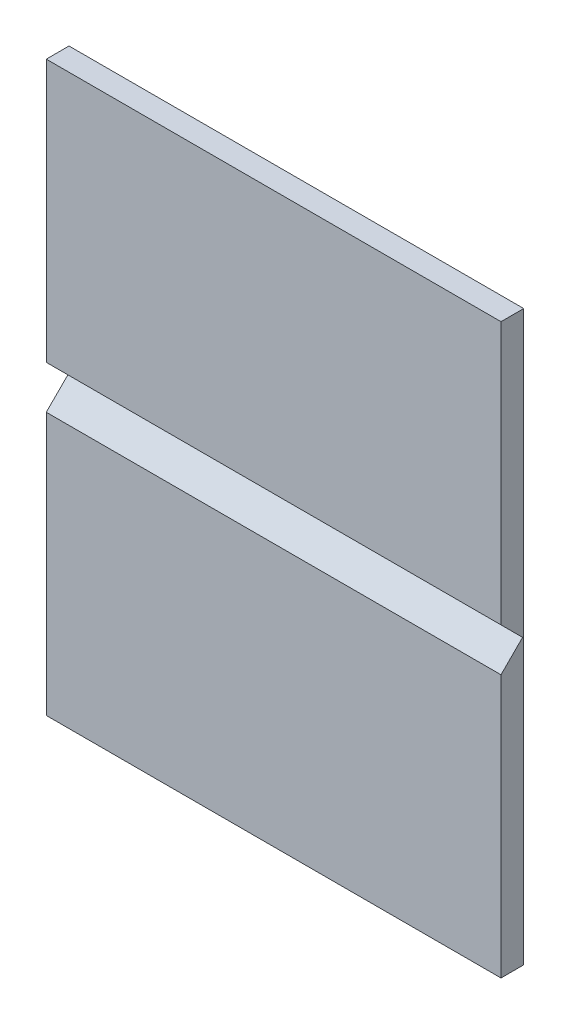
ISO-10303-21;
HEADER;
FILE_DESCRIPTION(('STEP AP214'),'2;1');
FILE_NAME('part.step','',(''),(''),'','','');
FILE_SCHEMA(('AUTOMOTIVE_DESIGN { 1 0 10303 214 1 1 1 1 }'));
ENDSEC;
DATA;
#1=APPLICATION_CONTEXT('core data for automotive mechanical design processes');
#2=APPLICATION_PROTOCOL_DEFINITION('international standard','automotive_design',2000,#1);
#3=PRODUCT_CONTEXT('',#1,'mechanical');
#4=PRODUCT('Part','Part','',(#3));
#5=PRODUCT_RELATED_PRODUCT_CATEGORY('part','',(#4));
#6=PRODUCT_DEFINITION_FORMATION('','',#4);
#7=PRODUCT_DEFINITION_CONTEXT('part definition',#1,'design');
#8=PRODUCT_DEFINITION('design','',#6,#7);
#9=PRODUCT_DEFINITION_SHAPE('','',#8);
#10=(LENGTH_UNIT() NAMED_UNIT(*) SI_UNIT(.MILLI.,.METRE.));
#11=(NAMED_UNIT(*) PLANE_ANGLE_UNIT() SI_UNIT($,.RADIAN.));
#12=(NAMED_UNIT(*) SI_UNIT($,.STERADIAN.) SOLID_ANGLE_UNIT());
#13=UNCERTAINTY_MEASURE_WITH_UNIT(LENGTH_MEASURE(1.E-05),#10,'distance_accuracy_value','');
#14=(GEOMETRIC_REPRESENTATION_CONTEXT(3) GLOBAL_UNCERTAINTY_ASSIGNED_CONTEXT((#13)) GLOBAL_UNIT_ASSIGNED_CONTEXT((#10,
#11,#12)) REPRESENTATION_CONTEXT('',''));
#15=CARTESIAN_POINT('',(0.,0.,0.));
#16=DIRECTION('',(0.,0.,1.));
#17=DIRECTION('',(1.,0.,0.));
#18=AXIS2_PLACEMENT_3D('',#15,#16,#17);
#19=CARTESIAN_POINT('',(0.,0.,20.));
#20=DIRECTION('',(0.,0.,-1.));
#21=DIRECTION('',(-1.,0.,0.));
#22=AXIS2_PLACEMENT_3D('',#19,#20,#21);
#23=PLANE('',#22);
#24=DIRECTION('',(0.,1.,0.));
#25=VECTOR('',#24,1.);
#26=CARTESIAN_POINT('',(200.,-250.,20.));
#27=LINE('',#26,#25);
#28=CARTESIAN_POINT('',(200.,-250.,20.));
#29=VERTEX_POINT('',#28);
#30=CARTESIAN_POINT('',(200.,-19.0000000000001,20.));
#31=VERTEX_POINT('',#30);
#32=EDGE_CURVE('E125',#29,#31,#27,.T.);
#33=ORIENTED_EDGE('',*,*,#32,.T.);
#34=DIRECTION('',(-1.,0.,0.));
#35=VECTOR('',#34,1.);
#36=CARTESIAN_POINT('',(0.,-19.0000000000001,20.));
#37=LINE('',#36,#35);
#38=CARTESIAN_POINT('',(-200.,-19.0000000000001,20.));
#39=VERTEX_POINT('',#38);
#40=EDGE_CURVE('E11',#31,#39,#37,.T.);
#41=ORIENTED_EDGE('',*,*,#40,.T.);
#42=DIRECTION('',(0.,-1.,0.));
#43=VECTOR('',#42,1.);
#44=CARTESIAN_POINT('',(-200.,-250.,20.));
#45=LINE('',#44,#43);
#46=CARTESIAN_POINT('',(-200.,-250.,20.));
#47=VERTEX_POINT('',#46);
#48=EDGE_CURVE('E120',#39,#47,#45,.T.);
#49=ORIENTED_EDGE('',*,*,#48,.T.);
#50=DIRECTION('',(1.,0.,0.));
#51=VECTOR('',#50,1.);
#52=CARTESIAN_POINT('',(-200.,-250.,20.));
#53=LINE('',#52,#51);
#54=EDGE_CURVE('E57',#47,#29,#53,.T.);
#55=ORIENTED_EDGE('',*,*,#54,.T.);
#56=EDGE_LOOP('',(#33,#41,#49,#55));
#57=FACE_BOUND('',#56,.T.);
#58=ADVANCED_FACE('F33',(#57),#23,.F.);
#59=CARTESIAN_POINT('',(200.,-250.,20.));
#60=DIRECTION('',(-1.,0.,0.));
#61=DIRECTION('',(0.,0.,1.));
#62=AXIS2_PLACEMENT_3D('',#59,#60,#61);
#63=PLANE('',#62);
#64=DIRECTION('',(0.,0.707106781186549,0.707106781186546));
#65=VECTOR('',#64,1.);
#66=CARTESIAN_POINT('',(200.,0.,0.999999999999977));
#67=LINE('',#66,#65);
#68=CARTESIAN_POINT('',(200.,0.,0.999999999999977));
#69=VERTEX_POINT('',#68);
#70=CARTESIAN_POINT('',(200.,19.0000000000001,20.));
#71=VERTEX_POINT('',#70);
#72=EDGE_CURVE('E48',#69,#71,#67,.T.);
#73=ORIENTED_EDGE('',*,*,#72,.F.);
#74=DIRECTION('',(0.,0.707106781186548,-0.707106781186547));
#75=VECTOR('',#74,1.);
#76=CARTESIAN_POINT('',(200.,0.,0.999999999999977));
#77=LINE('',#76,#75);
#78=EDGE_CURVE('E107',#31,#69,#77,.T.);
#79=ORIENTED_EDGE('',*,*,#78,.F.);
#80=ORIENTED_EDGE('',*,*,#32,.F.);
#81=DIRECTION('',(0.,0.,-1.));
#82=VECTOR('',#81,1.);
#83=CARTESIAN_POINT('',(200.,-250.,20.));
#84=LINE('',#83,#82);
#85=CARTESIAN_POINT('',(200.,-250.,0.));
#86=VERTEX_POINT('',#85);
#87=EDGE_CURVE('E132',#29,#86,#84,.T.);
#88=ORIENTED_EDGE('',*,*,#87,.T.);
#89=DIRECTION('',(0.,1.,0.));
#90=VECTOR('',#89,1.);
#91=CARTESIAN_POINT('',(200.,-250.,0.));
#92=LINE('',#91,#90);
#93=CARTESIAN_POINT('',(200.,250.,0.));
#94=VERTEX_POINT('',#93);
#95=EDGE_CURVE('E108',#86,#94,#92,.T.);
#96=ORIENTED_EDGE('',*,*,#95,.T.);
#97=DIRECTION('',(0.,0.,-1.));
#98=VECTOR('',#97,1.);
#99=CARTESIAN_POINT('',(200.,250.,20.));
#100=LINE('',#99,#98);
#101=CARTESIAN_POINT('',(200.,250.,20.));
#102=VERTEX_POINT('',#101);
#103=EDGE_CURVE('E146',#102,#94,#100,.T.);
#104=ORIENTED_EDGE('',*,*,#103,.F.);
#105=EDGE_CURVE('E85',#71,#102,#27,.T.);
#106=ORIENTED_EDGE('',*,*,#105,.F.);
#107=EDGE_LOOP('',(#73,#79,#80,#88,#96,#104,#106));
#108=FACE_BOUND('',#107,.T.);
#109=ADVANCED_FACE('F35',(#108),#63,.F.);
#110=CARTESIAN_POINT('',(-200.,250.,20.));
#111=DIRECTION('',(0.,-1.,0.));
#112=DIRECTION('',(0.,0.,-1.));
#113=AXIS2_PLACEMENT_3D('',#110,#111,#112);
#114=PLANE('',#113);
#115=DIRECTION('',(-1.,0.,0.));
#116=VECTOR('',#115,1.);
#117=CARTESIAN_POINT('',(-200.,250.,0.));
#118=LINE('',#117,#116);
#119=CARTESIAN_POINT('',(-200.,250.,0.));
#120=VERTEX_POINT('',#119);
#121=EDGE_CURVE('E135',#94,#120,#118,.T.);
#122=ORIENTED_EDGE('',*,*,#121,.T.);
#123=DIRECTION('',(0.,0.,-1.));
#124=VECTOR('',#123,1.);
#125=CARTESIAN_POINT('',(-200.,250.,20.));
#126=LINE('',#125,#124);
#127=CARTESIAN_POINT('',(-200.,250.,20.));
#128=VERTEX_POINT('',#127);
#129=EDGE_CURVE('E143',#128,#120,#126,.T.);
#130=ORIENTED_EDGE('',*,*,#129,.F.);
#131=DIRECTION('',(-1.,0.,0.));
#132=VECTOR('',#131,1.);
#133=CARTESIAN_POINT('',(-200.,250.,20.));
#134=LINE('',#133,#132);
#135=EDGE_CURVE('E127',#102,#128,#134,.T.);
#136=ORIENTED_EDGE('',*,*,#135,.F.);
#137=ORIENTED_EDGE('',*,*,#103,.T.);
#138=EDGE_LOOP('',(#122,#130,#136,#137));
#139=FACE_BOUND('',#138,.T.);
#140=ADVANCED_FACE('F153',(#139),#114,.F.);
#141=CARTESIAN_POINT('',(-200.,-250.,20.));
#142=DIRECTION('',(1.,0.,0.));
#143=DIRECTION('',(0.,0.,-1.));
#144=AXIS2_PLACEMENT_3D('',#141,#142,#143);
#145=PLANE('',#144);
#146=ORIENTED_EDGE('',*,*,#48,.F.);
#147=DIRECTION('',(0.,0.707106781186548,-0.707106781186547));
#148=VECTOR('',#147,1.);
#149=CARTESIAN_POINT('',(-200.,0.,0.999999999999977));
#150=LINE('',#149,#148);
#151=CARTESIAN_POINT('',(-200.,0.,0.999999999999977));
#152=VERTEX_POINT('',#151);
#153=EDGE_CURVE('E105',#39,#152,#150,.T.);
#154=ORIENTED_EDGE('',*,*,#153,.T.);
#155=DIRECTION('',(0.,0.707106781186549,0.707106781186546));
#156=VECTOR('',#155,1.);
#157=CARTESIAN_POINT('',(-200.,0.,0.999999999999977));
#158=LINE('',#157,#156);
#159=CARTESIAN_POINT('',(-200.,19.0000000000001,20.));
#160=VERTEX_POINT('',#159);
#161=EDGE_CURVE('E109',#152,#160,#158,.T.);
#162=ORIENTED_EDGE('',*,*,#161,.T.);
#163=EDGE_CURVE('E129',#128,#160,#45,.T.);
#164=ORIENTED_EDGE('',*,*,#163,.F.);
#165=ORIENTED_EDGE('',*,*,#129,.T.);
#166=DIRECTION('',(0.,-1.,0.));
#167=VECTOR('',#166,1.);
#168=CARTESIAN_POINT('',(-200.,-250.,0.));
#169=LINE('',#168,#167);
#170=CARTESIAN_POINT('',(-200.,-250.,0.));
#171=VERTEX_POINT('',#170);
#172=EDGE_CURVE('E137',#120,#171,#169,.T.);
#173=ORIENTED_EDGE('',*,*,#172,.T.);
#174=DIRECTION('',(0.,0.,-1.));
#175=VECTOR('',#174,1.);
#176=CARTESIAN_POINT('',(-200.,-250.,20.));
#177=LINE('',#176,#175);
#178=EDGE_CURVE('E141',#47,#171,#177,.T.);
#179=ORIENTED_EDGE('',*,*,#178,.F.);
#180=EDGE_LOOP('',(#146,#154,#162,#164,#165,#173,#179));
#181=FACE_BOUND('',#180,.T.);
#182=ADVANCED_FACE('F118',(#181),#145,.F.);
#183=CARTESIAN_POINT('',(-200.,-250.,20.));
#184=DIRECTION('',(0.,1.,0.));
#185=DIRECTION('',(0.,0.,1.));
#186=AXIS2_PLACEMENT_3D('',#183,#184,#185);
#187=PLANE('',#186);
#188=DIRECTION('',(1.,0.,0.));
#189=VECTOR('',#188,1.);
#190=CARTESIAN_POINT('',(-200.,-250.,0.));
#191=LINE('',#190,#189);
#192=EDGE_CURVE('E78',#171,#86,#191,.T.);
#193=ORIENTED_EDGE('',*,*,#192,.T.);
#194=ORIENTED_EDGE('',*,*,#87,.F.);
#195=ORIENTED_EDGE('',*,*,#54,.F.);
#196=ORIENTED_EDGE('',*,*,#178,.T.);
#197=EDGE_LOOP('',(#193,#194,#195,#196));
#198=FACE_BOUND('',#197,.T.);
#199=ADVANCED_FACE('F165',(#198),#187,.F.);
#200=ORIENTED_EDGE('',*,*,#163,.T.);
#201=DIRECTION('',(1.,0.,0.));
#202=VECTOR('',#201,1.);
#203=CARTESIAN_POINT('',(0.,19.,20.));
#204=LINE('',#203,#202);
#205=EDGE_CURVE('E41',#160,#71,#204,.T.);
#206=ORIENTED_EDGE('',*,*,#205,.T.);
#207=ORIENTED_EDGE('',*,*,#105,.T.);
#208=ORIENTED_EDGE('',*,*,#135,.T.);
#209=EDGE_LOOP('',(#200,#206,#207,#208));
#210=FACE_BOUND('',#209,.T.);
#211=ADVANCED_FACE('F148',(#210),#23,.F.);
#212=CARTESIAN_POINT('',(0.,0.,0.));
#213=DIRECTION('',(0.,0.,-1.));
#214=DIRECTION('',(-1.,0.,0.));
#215=AXIS2_PLACEMENT_3D('',#212,#213,#214);
#216=PLANE('',#215);
#217=ORIENTED_EDGE('',*,*,#95,.F.);
#218=ORIENTED_EDGE('',*,*,#192,.F.);
#219=ORIENTED_EDGE('',*,*,#172,.F.);
#220=ORIENTED_EDGE('',*,*,#121,.F.);
#221=EDGE_LOOP('',(#217,#218,#219,#220));
#222=FACE_BOUND('',#221,.T.);
#223=ADVANCED_FACE('F157',(#222),#216,.T.);
#224=CARTESIAN_POINT('',(-200.,0.,0.999999999999977));
#225=DIRECTION('',(0.,-0.707106781186547,-0.707106781186548));
#226=DIRECTION('',(0.,0.707106781186548,-0.707106781186547));
#227=AXIS2_PLACEMENT_3D('',#224,#225,#226);
#228=PLANE('',#227);
#229=ORIENTED_EDGE('',*,*,#78,.T.);
#230=DIRECTION('',(1.,0.,0.));
#231=VECTOR('',#230,1.);
#232=CARTESIAN_POINT('',(-200.,0.,0.999999999999977));
#233=LINE('',#232,#231);
#234=EDGE_CURVE('E101',#152,#69,#233,.T.);
#235=ORIENTED_EDGE('',*,*,#234,.F.);
#236=ORIENTED_EDGE('',*,*,#153,.F.);
#237=ORIENTED_EDGE('',*,*,#40,.F.);
#238=EDGE_LOOP('',(#229,#235,#236,#237));
#239=FACE_BOUND('',#238,.T.);
#240=ADVANCED_FACE('F103',(#239),#228,.F.);
#241=CARTESIAN_POINT('',(-200.,0.,0.999999999999977));
#242=DIRECTION('',(0.,0.707106781186547,-0.707106781186549));
#243=DIRECTION('',(0.,0.707106781186549,0.707106781186547));
#244=AXIS2_PLACEMENT_3D('',#241,#242,#243);
#245=PLANE('',#244);
#246=ORIENTED_EDGE('',*,*,#161,.F.);
#247=ORIENTED_EDGE('',*,*,#234,.T.);
#248=ORIENTED_EDGE('',*,*,#72,.T.);
#249=ORIENTED_EDGE('',*,*,#205,.F.);
#250=EDGE_LOOP('',(#246,#247,#248,#249));
#251=FACE_BOUND('',#250,.T.);
#252=ADVANCED_FACE('F112',(#251),#245,.F.);
#253=CLOSED_SHELL('',(#58,#109,#140,#182,#199,#211,#223,#240,#252));
#254=MANIFOLD_SOLID_BREP('B2',#253);
#255=ADVANCED_BREP_SHAPE_REPRESENTATION('',(#18,#254),#14);
#256=SHAPE_DEFINITION_REPRESENTATION(#9,#255);
ENDSEC;
END-ISO-10303-21;
